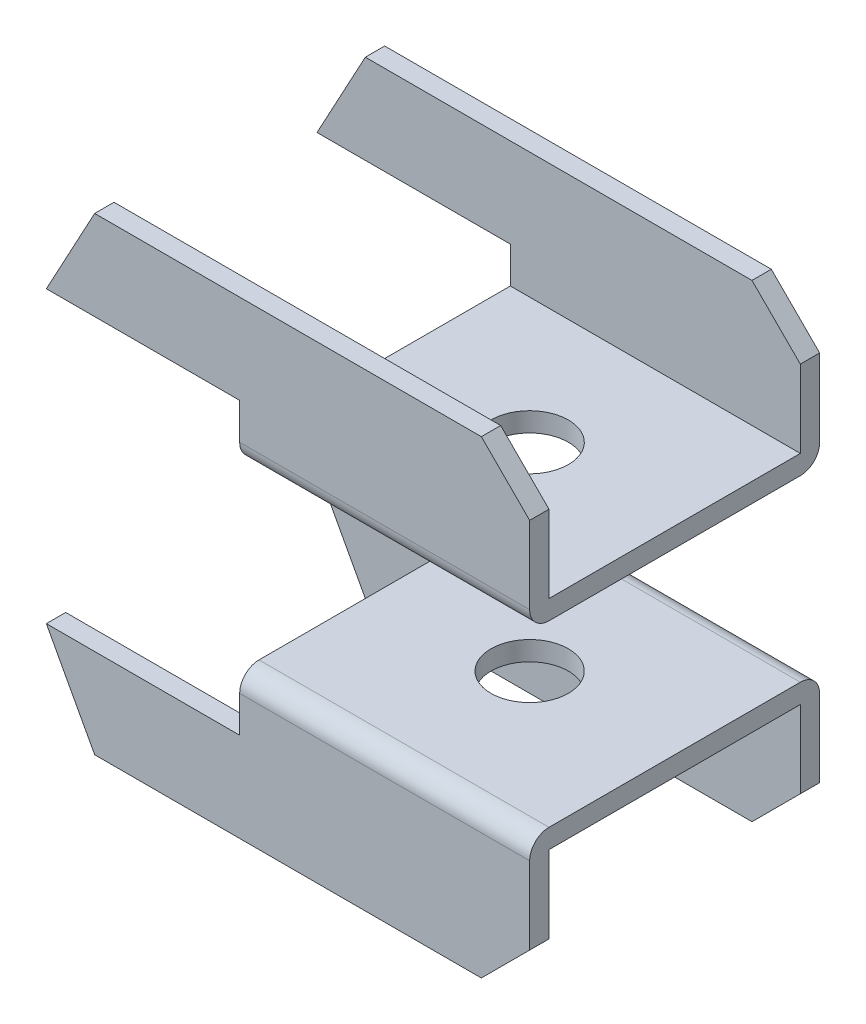
ISO-10303-21;
HEADER;
FILE_DESCRIPTION(('STEP AP214'),'2;1');
FILE_NAME('part.step','',(''),(''),'','','');
FILE_SCHEMA(('AUTOMOTIVE_DESIGN { 1 0 10303 214 1 1 1 1 }'));
ENDSEC;
DATA;
#1=APPLICATION_CONTEXT('core data for automotive mechanical design processes');
#2=APPLICATION_PROTOCOL_DEFINITION('international standard','automotive_design',2000,#1);
#3=PRODUCT_CONTEXT('',#1,'mechanical');
#4=PRODUCT('Part','Part','',(#3));
#5=PRODUCT_RELATED_PRODUCT_CATEGORY('part','',(#4));
#6=PRODUCT_DEFINITION_FORMATION('','',#4);
#7=PRODUCT_DEFINITION_CONTEXT('part definition',#1,'design');
#8=PRODUCT_DEFINITION('design','',#6,#7);
#9=PRODUCT_DEFINITION_SHAPE('','',#8);
#10=(LENGTH_UNIT() NAMED_UNIT(*) SI_UNIT(.MILLI.,.METRE.));
#11=(NAMED_UNIT(*) PLANE_ANGLE_UNIT() SI_UNIT($,.RADIAN.));
#12=(NAMED_UNIT(*) SI_UNIT($,.STERADIAN.) SOLID_ANGLE_UNIT());
#13=UNCERTAINTY_MEASURE_WITH_UNIT(LENGTH_MEASURE(1.E-05),#10,'distance_accuracy_value','');
#14=(GEOMETRIC_REPRESENTATION_CONTEXT(3) GLOBAL_UNCERTAINTY_ASSIGNED_CONTEXT((#13)) GLOBAL_UNIT_ASSIGNED_CONTEXT((#10,
#11,#12)) REPRESENTATION_CONTEXT('',''));
#15=CARTESIAN_POINT('',(0.,0.,0.));
#16=DIRECTION('',(0.,0.,1.));
#17=DIRECTION('',(1.,0.,0.));
#18=AXIS2_PLACEMENT_3D('',#15,#16,#17);
#19=CARTESIAN_POINT('',(0.,0.,-4.));
#20=DIRECTION('',(0.,0.,1.));
#21=DIRECTION('',(1.,0.,0.));
#22=AXIS2_PLACEMENT_3D('',#19,#20,#21);
#23=PLANE('',#22);
#24=DIRECTION('',(0.,-1.,0.));
#25=VECTOR('',#24,1.);
#26=CARTESIAN_POINT('',(60.,0.,-4.));
#27=LINE('',#26,#25);
#28=CARTESIAN_POINT('',(60.,7.5,-4.));
#29=VERTEX_POINT('',#28);
#30=CARTESIAN_POINT('',(60.,-8.49999999999999,-4.));
#31=VERTEX_POINT('',#30);
#32=EDGE_CURVE('E220',#29,#31,#27,.T.);
#33=ORIENTED_EDGE('',*,*,#32,.T.);
#34=DIRECTION('',(-0.707106781186548,-0.707106781186547,0.));
#35=VECTOR('',#34,1.);
#36=CARTESIAN_POINT('',(34.25,-34.25,-4.));
#37=LINE('',#36,#35);
#38=CARTESIAN_POINT('',(50.,-18.5,-4.));
#39=VERTEX_POINT('',#38);
#40=EDGE_CURVE('E293',#31,#39,#37,.T.);
#41=ORIENTED_EDGE('',*,*,#40,.T.);
#42=DIRECTION('',(-1.,0.,0.));
#43=VECTOR('',#42,1.);
#44=CARTESIAN_POINT('',(0.,-18.5,-4.));
#45=LINE('',#44,#43);
#46=CARTESIAN_POINT('',(-30.,-18.5,-4.));
#47=VERTEX_POINT('',#46);
#48=EDGE_CURVE('E218',#39,#47,#45,.T.);
#49=ORIENTED_EDGE('',*,*,#48,.T.);
#50=DIRECTION('',(-0.475517034365474,0.879706513576127,0.));
#51=VECTOR('',#50,1.);
#52=CARTESIAN_POINT('',(-30.9553420011306,-16.7326172979084,-4.));
#53=LINE('',#52,#51);
#54=CARTESIAN_POINT('',(-40.,0.,-4.));
#55=VERTEX_POINT('',#54);
#56=EDGE_CURVE('E215',#47,#55,#53,.T.);
#57=ORIENTED_EDGE('',*,*,#56,.T.);
#58=DIRECTION('',(1.,0.,0.));
#59=VECTOR('',#58,1.);
#60=CARTESIAN_POINT('',(0.,0.,-4.));
#61=LINE('',#60,#59);
#62=CARTESIAN_POINT('',(0.,0.,-4.));
#63=VERTEX_POINT('',#62);
#64=EDGE_CURVE('E212',#55,#63,#61,.T.);
#65=ORIENTED_EDGE('',*,*,#64,.T.);
#66=DIRECTION('',(0.,-1.,0.));
#67=VECTOR('',#66,1.);
#68=CARTESIAN_POINT('',(0.,0.,-4.));
#69=LINE('',#68,#67);
#70=CARTESIAN_POINT('',(0.,7.5,-4.));
#71=VERTEX_POINT('',#70);
#72=EDGE_CURVE('E223',#71,#63,#69,.T.);
#73=ORIENTED_EDGE('',*,*,#72,.F.);
#74=DIRECTION('',(-1.,0.,0.));
#75=VECTOR('',#74,1.);
#76=CARTESIAN_POINT('',(60.,7.5,-4.));
#77=LINE('',#76,#75);
#78=EDGE_CURVE('E195',#29,#71,#77,.T.);
#79=ORIENTED_EDGE('',*,*,#78,.F.);
#80=EDGE_LOOP('',(#33,#41,#49,#57,#65,#73,#79));
#81=FACE_BOUND('',#80,.T.);
#82=ADVANCED_FACE('F48',(#81),#23,.F.);
#83=CARTESIAN_POINT('',(0.,0.,-4.));
#84=DIRECTION('',(0.,-1.,0.));
#85=DIRECTION('',(1.,0.,0.));
#86=AXIS2_PLACEMENT_3D('',#83,#84,#85);
#87=PLANE('',#86);
#88=DIRECTION('',(1.,0.,0.));
#89=VECTOR('',#88,1.);
#90=CARTESIAN_POINT('',(0.,0.,0.));
#91=LINE('',#90,#89);
#92=CARTESIAN_POINT('',(-40.,0.,0.));
#93=VERTEX_POINT('',#92);
#94=CARTESIAN_POINT('',(0.,0.,0.));
#95=VERTEX_POINT('',#94);
#96=EDGE_CURVE('E211',#93,#95,#91,.T.);
#97=ORIENTED_EDGE('',*,*,#96,.T.);
#98=DIRECTION('',(0.,0.,1.));
#99=VECTOR('',#98,1.);
#100=CARTESIAN_POINT('',(0.,0.,-4.));
#101=LINE('',#100,#99);
#102=EDGE_CURVE('E235',#63,#95,#101,.T.);
#103=ORIENTED_EDGE('',*,*,#102,.F.);
#104=ORIENTED_EDGE('',*,*,#64,.F.);
#105=DIRECTION('',(0.,0.,1.));
#106=VECTOR('',#105,1.);
#107=CARTESIAN_POINT('',(-40.,0.,-4.));
#108=LINE('',#107,#106);
#109=EDGE_CURVE('E225',#55,#93,#108,.T.);
#110=ORIENTED_EDGE('',*,*,#109,.T.);
#111=EDGE_LOOP('',(#97,#103,#104,#110));
#112=FACE_BOUND('',#111,.T.);
#113=ADVANCED_FACE('F330',(#112),#87,.F.);
#114=CARTESIAN_POINT('',(0.,0.,-4.));
#115=DIRECTION('',(-1.,0.,0.));
#116=DIRECTION('',(0.,0.,1.));
#117=AXIS2_PLACEMENT_3D('',#114,#115,#116);
#118=PLANE('',#117);
#119=DIRECTION('',(0.,0.,1.));
#120=VECTOR('',#119,1.);
#121=CARTESIAN_POINT('',(0.,11.5,-4.));
#122=LINE('',#121,#120);
#123=CARTESIAN_POINT('',(0.,11.5,-56.));
#124=VERTEX_POINT('',#123);
#125=CARTESIAN_POINT('',(0.,11.5,-4.));
#126=VERTEX_POINT('',#125);
#127=EDGE_CURVE('E238',#124,#126,#122,.T.);
#128=ORIENTED_EDGE('',*,*,#127,.F.);
#129=CARTESIAN_POINT('',(0.,7.5,-56.));
#130=DIRECTION('',(-1.,0.,0.));
#131=DIRECTION('',(0.,0.,1.));
#132=AXIS2_PLACEMENT_3D('',#129,#130,#131);
#133=CIRCLE('',#132,4.);
#134=CARTESIAN_POINT('',(0.,7.5,-60.));
#135=VERTEX_POINT('',#134);
#136=EDGE_CURVE('E57',#124,#135,#133,.T.);
#137=ORIENTED_EDGE('',*,*,#136,.T.);
#138=DIRECTION('',(0.,-1.,0.));
#139=VECTOR('',#138,1.);
#140=CARTESIAN_POINT('',(0.,0.,-60.));
#141=LINE('',#140,#139);
#142=CARTESIAN_POINT('',(0.,0.,-60.));
#143=VERTEX_POINT('',#142);
#144=EDGE_CURVE('E183',#135,#143,#141,.T.);
#145=ORIENTED_EDGE('',*,*,#144,.T.);
#146=DIRECTION('',(0.,0.,-1.));
#147=VECTOR('',#146,1.);
#148=CARTESIAN_POINT('',(0.,0.,-56.));
#149=LINE('',#148,#147);
#150=CARTESIAN_POINT('',(0.,0.,-56.));
#151=VERTEX_POINT('',#150);
#152=EDGE_CURVE('E192',#151,#143,#149,.T.);
#153=ORIENTED_EDGE('',*,*,#152,.F.);
#154=DIRECTION('',(0.,-1.,0.));
#155=VECTOR('',#154,1.);
#156=CARTESIAN_POINT('',(0.,0.,-56.));
#157=LINE('',#156,#155);
#158=CARTESIAN_POINT('',(0.,7.5,-56.));
#159=VERTEX_POINT('',#158);
#160=EDGE_CURVE('E202',#159,#151,#157,.T.);
#161=ORIENTED_EDGE('',*,*,#160,.F.);
#162=DIRECTION('',(0.,0.,1.));
#163=VECTOR('',#162,1.);
#164=CARTESIAN_POINT('',(0.,7.5,-56.));
#165=LINE('',#164,#163);
#166=EDGE_CURVE('E205',#159,#71,#165,.T.);
#167=ORIENTED_EDGE('',*,*,#166,.T.);
#168=ORIENTED_EDGE('',*,*,#72,.T.);
#169=ORIENTED_EDGE('',*,*,#102,.T.);
#170=DIRECTION('',(0.,-1.,0.));
#171=VECTOR('',#170,1.);
#172=CARTESIAN_POINT('',(0.,0.,0.));
#173=LINE('',#172,#171);
#174=CARTESIAN_POINT('',(0.,7.5,0.));
#175=VERTEX_POINT('',#174);
#176=EDGE_CURVE('E216',#175,#95,#173,.T.);
#177=ORIENTED_EDGE('',*,*,#176,.F.);
#178=CARTESIAN_POINT('',(0.,7.5,-4.));
#179=DIRECTION('',(-1.,0.,0.));
#180=DIRECTION('',(0.,0.,1.));
#181=AXIS2_PLACEMENT_3D('',#178,#179,#180);
#182=CIRCLE('',#181,4.);
#183=EDGE_CURVE('E259',#175,#126,#182,.T.);
#184=ORIENTED_EDGE('',*,*,#183,.T.);
#185=EDGE_LOOP('',(#128,#137,#145,#153,#161,#167,#168,#169,#177,#184));
#186=FACE_BOUND('',#185,.T.);
#187=ADVANCED_FACE('F264',(#186),#118,.T.);
#188=CARTESIAN_POINT('',(0.,11.5,-4.));
#189=DIRECTION('',(0.,-1.,0.));
#190=DIRECTION('',(0.,0.,-1.));
#191=AXIS2_PLACEMENT_3D('',#188,#189,#190);
#192=PLANE('',#191);
#193=CARTESIAN_POINT('',(30.,11.5,-30.));
#194=DIRECTION('',(0.,-1.,0.));
#195=DIRECTION('',(0.,0.,-1.));
#196=AXIS2_PLACEMENT_3D('',#193,#194,#195);
#197=CIRCLE('',#196,8.);
#198=CARTESIAN_POINT('',(30.,11.5,-38.));
#199=VERTEX_POINT('',#198);
#200=EDGE_CURVE('E285',#199,#199,#197,.T.);
#201=ORIENTED_EDGE('',*,*,#200,.T.);
#202=EDGE_LOOP('',(#201));
#203=FACE_BOUND('',#202,.T.);
#204=DIRECTION('',(0.,0.,1.));
#205=VECTOR('',#204,1.);
#206=CARTESIAN_POINT('',(60.,11.5,-4.));
#207=LINE('',#206,#205);
#208=CARTESIAN_POINT('',(60.,11.5,-56.));
#209=VERTEX_POINT('',#208);
#210=CARTESIAN_POINT('',(60.,11.5,-4.));
#211=VERTEX_POINT('',#210);
#212=EDGE_CURVE('E241',#209,#211,#207,.T.);
#213=ORIENTED_EDGE('',*,*,#212,.F.);
#214=DIRECTION('',(1.,0.,0.));
#215=VECTOR('',#214,1.);
#216=CARTESIAN_POINT('',(0.,11.5,-56.));
#217=LINE('',#216,#215);
#218=EDGE_CURVE('E257',#209,#124,#217,.F.);
#219=ORIENTED_EDGE('',*,*,#218,.T.);
#220=ORIENTED_EDGE('',*,*,#127,.T.);
#221=DIRECTION('',(1.,0.,0.));
#222=VECTOR('',#221,1.);
#223=CARTESIAN_POINT('',(60.,11.5,-4.));
#224=LINE('',#223,#222);
#225=EDGE_CURVE('E254',#126,#211,#224,.T.);
#226=ORIENTED_EDGE('',*,*,#225,.T.);
#227=EDGE_LOOP('',(#213,#219,#220,#226));
#228=FACE_BOUND('',#227,.T.);
#229=ADVANCED_FACE('F273',(#203,#228),#192,.F.);
#230=CARTESIAN_POINT('',(60.,0.,-4.));
#231=DIRECTION('',(-1.,0.,0.));
#232=DIRECTION('',(0.,-1.,0.));
#233=AXIS2_PLACEMENT_3D('',#230,#231,#232);
#234=PLANE('',#233);
#235=DIRECTION('',(0.,-1.,0.));
#236=VECTOR('',#235,1.);
#237=CARTESIAN_POINT('',(60.,0.,0.));
#238=LINE('',#237,#236);
#239=CARTESIAN_POINT('',(60.,7.5,0.));
#240=VERTEX_POINT('',#239);
#241=CARTESIAN_POINT('',(60.,-8.49999999999999,0.));
#242=VERTEX_POINT('',#241);
#243=EDGE_CURVE('E232',#240,#242,#238,.T.);
#244=ORIENTED_EDGE('',*,*,#243,.T.);
#245=DIRECTION('',(0.,0.,1.));
#246=VECTOR('',#245,1.);
#247=CARTESIAN_POINT('',(60.,-8.49999999999999,-60.));
#248=LINE('',#247,#246);
#249=EDGE_CURVE('E64',#31,#242,#248,.T.);
#250=ORIENTED_EDGE('',*,*,#249,.F.);
#251=ORIENTED_EDGE('',*,*,#32,.F.);
#252=DIRECTION('',(0.,0.,1.));
#253=VECTOR('',#252,1.);
#254=CARTESIAN_POINT('',(60.,7.5,-56.));
#255=LINE('',#254,#253);
#256=CARTESIAN_POINT('',(60.,7.5,-56.));
#257=VERTEX_POINT('',#256);
#258=EDGE_CURVE('E208',#257,#29,#255,.T.);
#259=ORIENTED_EDGE('',*,*,#258,.F.);
#260=DIRECTION('',(0.,-1.,0.));
#261=VECTOR('',#260,1.);
#262=CARTESIAN_POINT('',(60.,0.,-56.));
#263=LINE('',#262,#261);
#264=CARTESIAN_POINT('',(60.,-8.49999999999999,-56.));
#265=VERTEX_POINT('',#264);
#266=EDGE_CURVE('E175',#257,#265,#263,.T.);
#267=ORIENTED_EDGE('',*,*,#266,.T.);
#268=CARTESIAN_POINT('',(60.,-8.49999999999999,-60.));
#269=VERTEX_POINT('',#268);
#270=EDGE_CURVE('E161',#269,#265,#248,.T.);
#271=ORIENTED_EDGE('',*,*,#270,.F.);
#272=DIRECTION('',(0.,-1.,0.));
#273=VECTOR('',#272,1.);
#274=CARTESIAN_POINT('',(60.,0.,-60.));
#275=LINE('',#274,#273);
#276=CARTESIAN_POINT('',(60.,7.5,-60.));
#277=VERTEX_POINT('',#276);
#278=EDGE_CURVE('E173',#277,#269,#275,.T.);
#279=ORIENTED_EDGE('',*,*,#278,.F.);
#280=CARTESIAN_POINT('',(60.,7.5,-56.));
#281=DIRECTION('',(-1.,0.,0.));
#282=DIRECTION('',(0.,-1.,0.));
#283=AXIS2_PLACEMENT_3D('',#280,#281,#282);
#284=CIRCLE('',#283,4.);
#285=EDGE_CURVE('E252',#277,#209,#284,.F.);
#286=ORIENTED_EDGE('',*,*,#285,.T.);
#287=ORIENTED_EDGE('',*,*,#212,.T.);
#288=CARTESIAN_POINT('',(60.,7.5,-4.));
#289=DIRECTION('',(-1.,0.,0.));
#290=DIRECTION('',(0.,-1.,0.));
#291=AXIS2_PLACEMENT_3D('',#288,#289,#290);
#292=CIRCLE('',#291,4.);
#293=EDGE_CURVE('E250',#211,#240,#292,.F.);
#294=ORIENTED_EDGE('',*,*,#293,.T.);
#295=EDGE_LOOP('',(#244,#250,#251,#259,#267,#271,#279,#286,#287,#294));
#296=FACE_BOUND('',#295,.T.);
#297=ADVANCED_FACE('F172',(#296),#234,.F.);
#298=CARTESIAN_POINT('',(0.,-18.5,-4.));
#299=DIRECTION('',(0.,1.,0.));
#300=DIRECTION('',(0.,0.,1.));
#301=AXIS2_PLACEMENT_3D('',#298,#299,#300);
#302=PLANE('',#301);
#303=ORIENTED_EDGE('',*,*,#48,.F.);
#304=DIRECTION('',(0.,0.,1.));
#305=VECTOR('',#304,1.);
#306=CARTESIAN_POINT('',(50.,-18.5,-60.));
#307=LINE('',#306,#305);
#308=CARTESIAN_POINT('',(50.,-18.5,0.));
#309=VERTEX_POINT('',#308);
#310=EDGE_CURVE('E176',#39,#309,#307,.T.);
#311=ORIENTED_EDGE('',*,*,#310,.T.);
#312=DIRECTION('',(-1.,0.,0.));
#313=VECTOR('',#312,1.);
#314=CARTESIAN_POINT('',(0.,-18.5,0.));
#315=LINE('',#314,#313);
#316=CARTESIAN_POINT('',(-30.,-18.5,0.));
#317=VERTEX_POINT('',#316);
#318=EDGE_CURVE('E230',#309,#317,#315,.T.);
#319=ORIENTED_EDGE('',*,*,#318,.T.);
#320=DIRECTION('',(0.,0.,1.));
#321=VECTOR('',#320,1.);
#322=CARTESIAN_POINT('',(-30.,-18.5,-4.));
#323=LINE('',#322,#321);
#324=EDGE_CURVE('E244',#47,#317,#323,.T.);
#325=ORIENTED_EDGE('',*,*,#324,.F.);
#326=EDGE_LOOP('',(#303,#311,#319,#325));
#327=FACE_BOUND('',#326,.T.);
#328=ADVANCED_FACE('F338',(#327),#302,.F.);
#329=CARTESIAN_POINT('',(-30.9553420011306,-16.7326172979084,-4.));
#330=DIRECTION('',(0.879706513576127,0.475517034365474,0.));
#331=DIRECTION('',(-0.475517034365474,0.879706513576127,0.));
#332=AXIS2_PLACEMENT_3D('',#329,#330,#331);
#333=PLANE('',#332);
#334=DIRECTION('',(-0.475517034365474,0.879706513576127,0.));
#335=VECTOR('',#334,1.);
#336=CARTESIAN_POINT('',(-30.9553420011306,-16.7326172979084,0.));
#337=LINE('',#336,#335);
#338=EDGE_CURVE('E228',#317,#93,#337,.T.);
#339=ORIENTED_EDGE('',*,*,#338,.T.);
#340=ORIENTED_EDGE('',*,*,#109,.F.);
#341=ORIENTED_EDGE('',*,*,#56,.F.);
#342=ORIENTED_EDGE('',*,*,#324,.T.);
#343=EDGE_LOOP('',(#339,#340,#341,#342));
#344=FACE_BOUND('',#343,.T.);
#345=ADVANCED_FACE('F333',(#344),#333,.F.);
#346=CARTESIAN_POINT('',(0.,0.,0.));
#347=DIRECTION('',(0.,0.,1.));
#348=DIRECTION('',(1.,0.,0.));
#349=AXIS2_PLACEMENT_3D('',#346,#347,#348);
#350=PLANE('',#349);
#351=DIRECTION('',(-0.707106781186548,-0.707106781186547,0.));
#352=VECTOR('',#351,1.);
#353=CARTESIAN_POINT('',(50.,-18.5,0.));
#354=LINE('',#353,#352);
#355=EDGE_CURVE('E166',#242,#309,#354,.T.);
#356=ORIENTED_EDGE('',*,*,#355,.F.);
#357=ORIENTED_EDGE('',*,*,#243,.F.);
#358=DIRECTION('',(1.,0.,0.));
#359=VECTOR('',#358,1.);
#360=CARTESIAN_POINT('',(0.,7.5,0.));
#361=LINE('',#360,#359);
#362=EDGE_CURVE('E12',#240,#175,#361,.F.);
#363=ORIENTED_EDGE('',*,*,#362,.T.);
#364=ORIENTED_EDGE('',*,*,#176,.T.);
#365=ORIENTED_EDGE('',*,*,#96,.F.);
#366=ORIENTED_EDGE('',*,*,#338,.F.);
#367=ORIENTED_EDGE('',*,*,#318,.F.);
#368=EDGE_LOOP('',(#356,#357,#363,#364,#365,#366,#367));
#369=FACE_BOUND('',#368,.T.);
#370=ADVANCED_FACE('F280',(#369),#350,.T.);
#371=CARTESIAN_POINT('',(60.,7.5,-56.));
#372=DIRECTION('',(0.,1.,0.));
#373=DIRECTION('',(0.,0.,1.));
#374=AXIS2_PLACEMENT_3D('',#371,#372,#373);
#375=PLANE('',#374);
#376=CARTESIAN_POINT('',(30.,7.5,-30.));
#377=DIRECTION('',(0.,1.,0.));
#378=DIRECTION('',(0.,0.,1.));
#379=AXIS2_PLACEMENT_3D('',#376,#377,#378);
#380=CIRCLE('',#379,8.);
#381=CARTESIAN_POINT('',(30.,7.5,-22.));
#382=VERTEX_POINT('',#381);
#383=EDGE_CURVE('E52',#382,#382,#380,.T.);
#384=ORIENTED_EDGE('',*,*,#383,.T.);
#385=EDGE_LOOP('',(#384));
#386=FACE_BOUND('',#385,.T.);
#387=ORIENTED_EDGE('',*,*,#78,.T.);
#388=ORIENTED_EDGE('',*,*,#166,.F.);
#389=DIRECTION('',(-1.,0.,0.));
#390=VECTOR('',#389,1.);
#391=CARTESIAN_POINT('',(60.,7.5,-56.));
#392=LINE('',#391,#390);
#393=EDGE_CURVE('E296',#257,#159,#392,.T.);
#394=ORIENTED_EDGE('',*,*,#393,.F.);
#395=ORIENTED_EDGE('',*,*,#258,.T.);
#396=EDGE_LOOP('',(#387,#388,#394,#395));
#397=FACE_BOUND('',#396,.T.);
#398=ADVANCED_FACE('F323',(#386,#397),#375,.F.);
#399=CARTESIAN_POINT('',(0.,0.,-56.));
#400=DIRECTION('',(0.,0.,-1.));
#401=DIRECTION('',(1.,0.,0.));
#402=AXIS2_PLACEMENT_3D('',#399,#400,#401);
#403=PLANE('',#402);
#404=DIRECTION('',(-1.,0.,0.));
#405=VECTOR('',#404,1.);
#406=CARTESIAN_POINT('',(0.,-18.5,-56.));
#407=LINE('',#406,#405);
#408=CARTESIAN_POINT('',(50.,-18.5,-56.));
#409=VERTEX_POINT('',#408);
#410=CARTESIAN_POINT('',(-30.,-18.5,-56.));
#411=VERTEX_POINT('',#410);
#412=EDGE_CURVE('E304',#409,#411,#407,.T.);
#413=ORIENTED_EDGE('',*,*,#412,.F.);
#414=DIRECTION('',(0.707106781186548,0.707106781186547,0.));
#415=VECTOR('',#414,1.);
#416=CARTESIAN_POINT('',(34.25,-34.25,-56.));
#417=LINE('',#416,#415);
#418=EDGE_CURVE('E290',#409,#265,#417,.T.);
#419=ORIENTED_EDGE('',*,*,#418,.T.);
#420=ORIENTED_EDGE('',*,*,#266,.F.);
#421=ORIENTED_EDGE('',*,*,#393,.T.);
#422=ORIENTED_EDGE('',*,*,#160,.T.);
#423=DIRECTION('',(1.,0.,0.));
#424=VECTOR('',#423,1.);
#425=CARTESIAN_POINT('',(0.,0.,-56.));
#426=LINE('',#425,#424);
#427=CARTESIAN_POINT('',(-40.,0.,-56.));
#428=VERTEX_POINT('',#427);
#429=EDGE_CURVE('E186',#428,#151,#426,.T.);
#430=ORIENTED_EDGE('',*,*,#429,.F.);
#431=DIRECTION('',(-0.475517034365474,0.879706513576127,0.));
#432=VECTOR('',#431,1.);
#433=CARTESIAN_POINT('',(-30.9553420011306,-16.7326172979084,-56.));
#434=LINE('',#433,#432);
#435=EDGE_CURVE('E301',#411,#428,#434,.T.);
#436=ORIENTED_EDGE('',*,*,#435,.F.);
#437=EDGE_LOOP('',(#413,#419,#420,#421,#422,#430,#436));
#438=FACE_BOUND('',#437,.T.);
#439=ADVANCED_FACE('F321',(#438),#403,.F.);
#440=CARTESIAN_POINT('',(0.,0.,-56.));
#441=DIRECTION('',(0.,-1.,0.));
#442=DIRECTION('',(1.,0.,0.));
#443=AXIS2_PLACEMENT_3D('',#440,#441,#442);
#444=PLANE('',#443);
#445=DIRECTION('',(1.,0.,0.));
#446=VECTOR('',#445,1.);
#447=CARTESIAN_POINT('',(0.,0.,-60.));
#448=LINE('',#447,#446);
#449=CARTESIAN_POINT('',(-40.,0.,-60.));
#450=VERTEX_POINT('',#449);
#451=EDGE_CURVE('E269',#450,#143,#448,.T.);
#452=ORIENTED_EDGE('',*,*,#451,.F.);
#453=DIRECTION('',(0.,0.,-1.));
#454=VECTOR('',#453,1.);
#455=CARTESIAN_POINT('',(-40.,0.,-56.));
#456=LINE('',#455,#454);
#457=EDGE_CURVE('E199',#428,#450,#456,.T.);
#458=ORIENTED_EDGE('',*,*,#457,.F.);
#459=ORIENTED_EDGE('',*,*,#429,.T.);
#460=ORIENTED_EDGE('',*,*,#152,.T.);
#461=EDGE_LOOP('',(#452,#458,#459,#460));
#462=FACE_BOUND('',#461,.T.);
#463=ADVANCED_FACE('F316',(#462),#444,.F.);
#464=CARTESIAN_POINT('',(0.,-18.5,-56.));
#465=DIRECTION('',(0.,1.,0.));
#466=DIRECTION('',(0.,0.,-1.));
#467=AXIS2_PLACEMENT_3D('',#464,#465,#466);
#468=PLANE('',#467);
#469=DIRECTION('',(-1.,0.,0.));
#470=VECTOR('',#469,1.);
#471=CARTESIAN_POINT('',(0.,-18.5,-60.));
#472=LINE('',#471,#470);
#473=CARTESIAN_POINT('',(50.,-18.5,-60.));
#474=VERTEX_POINT('',#473);
#475=CARTESIAN_POINT('',(-30.,-18.5,-60.));
#476=VERTEX_POINT('',#475);
#477=EDGE_CURVE('E184',#474,#476,#472,.T.);
#478=ORIENTED_EDGE('',*,*,#477,.F.);
#479=EDGE_CURVE('E72',#474,#409,#307,.T.);
#480=ORIENTED_EDGE('',*,*,#479,.T.);
#481=ORIENTED_EDGE('',*,*,#412,.T.);
#482=DIRECTION('',(0.,0.,-1.));
#483=VECTOR('',#482,1.);
#484=CARTESIAN_POINT('',(-30.,-18.5,-56.));
#485=LINE('',#484,#483);
#486=EDGE_CURVE('E196',#411,#476,#485,.T.);
#487=ORIENTED_EDGE('',*,*,#486,.T.);
#488=EDGE_LOOP('',(#478,#480,#481,#487));
#489=FACE_BOUND('',#488,.T.);
#490=ADVANCED_FACE('F380',(#489),#468,.F.);
#491=CARTESIAN_POINT('',(-30.9553420011306,-16.7326172979084,-56.));
#492=DIRECTION('',(0.879706513576127,0.475517034365474,0.));
#493=DIRECTION('',(-0.475517034365474,0.879706513576127,0.));
#494=AXIS2_PLACEMENT_3D('',#491,#492,#493);
#495=PLANE('',#494);
#496=DIRECTION('',(-0.475517034365474,0.879706513576127,0.));
#497=VECTOR('',#496,1.);
#498=CARTESIAN_POINT('',(-30.9553420011306,-16.7326172979084,-60.));
#499=LINE('',#498,#497);
#500=EDGE_CURVE('E188',#476,#450,#499,.T.);
#501=ORIENTED_EDGE('',*,*,#500,.F.);
#502=ORIENTED_EDGE('',*,*,#486,.F.);
#503=ORIENTED_EDGE('',*,*,#435,.T.);
#504=ORIENTED_EDGE('',*,*,#457,.T.);
#505=EDGE_LOOP('',(#501,#502,#503,#504));
#506=FACE_BOUND('',#505,.T.);
#507=ADVANCED_FACE('F312',(#506),#495,.F.);
#508=CARTESIAN_POINT('',(0.,0.,-60.));
#509=DIRECTION('',(0.,0.,-1.));
#510=DIRECTION('',(1.,0.,0.));
#511=AXIS2_PLACEMENT_3D('',#508,#509,#510);
#512=PLANE('',#511);
#513=DIRECTION('',(-0.707106781186548,-0.707106781186547,0.));
#514=VECTOR('',#513,1.);
#515=CARTESIAN_POINT('',(50.,-18.5,-60.));
#516=LINE('',#515,#514);
#517=EDGE_CURVE('E158',#269,#474,#516,.T.);
#518=ORIENTED_EDGE('',*,*,#517,.T.);
#519=ORIENTED_EDGE('',*,*,#477,.T.);
#520=ORIENTED_EDGE('',*,*,#500,.T.);
#521=ORIENTED_EDGE('',*,*,#451,.T.);
#522=ORIENTED_EDGE('',*,*,#144,.F.);
#523=DIRECTION('',(1.,0.,0.));
#524=VECTOR('',#523,1.);
#525=CARTESIAN_POINT('',(60.,7.5,-60.));
#526=LINE('',#525,#524);
#527=EDGE_CURVE('E182',#135,#277,#526,.T.);
#528=ORIENTED_EDGE('',*,*,#527,.T.);
#529=ORIENTED_EDGE('',*,*,#278,.T.);
#530=EDGE_LOOP('',(#518,#519,#520,#521,#522,#528,#529));
#531=FACE_BOUND('',#530,.T.);
#532=ADVANCED_FACE('F179',(#531),#512,.T.);
#533=CARTESIAN_POINT('',(0.,7.5,-56.));
#534=DIRECTION('',(-1.,0.,0.));
#535=DIRECTION('',(0.,0.,1.));
#536=AXIS2_PLACEMENT_3D('',#533,#534,#535);
#537=CYLINDRICAL_SURFACE('',#536,4.);
#538=ORIENTED_EDGE('',*,*,#136,.F.);
#539=ORIENTED_EDGE('',*,*,#218,.F.);
#540=ORIENTED_EDGE('',*,*,#285,.F.);
#541=ORIENTED_EDGE('',*,*,#527,.F.);
#542=EDGE_LOOP('',(#538,#539,#540,#541));
#543=FACE_BOUND('',#542,.T.);
#544=ADVANCED_FACE('F270',(#543),#537,.T.);
#545=CARTESIAN_POINT('',(0.,7.5,-4.));
#546=DIRECTION('',(-1.,0.,0.));
#547=DIRECTION('',(0.,0.,1.));
#548=AXIS2_PLACEMENT_3D('',#545,#546,#547);
#549=CYLINDRICAL_SURFACE('',#548,4.);
#550=ORIENTED_EDGE('',*,*,#183,.F.);
#551=ORIENTED_EDGE('',*,*,#362,.F.);
#552=ORIENTED_EDGE('',*,*,#293,.F.);
#553=ORIENTED_EDGE('',*,*,#225,.F.);
#554=EDGE_LOOP('',(#550,#551,#552,#553));
#555=FACE_BOUND('',#554,.T.);
#556=ADVANCED_FACE('F50',(#555),#549,.T.);
#557=CARTESIAN_POINT('',(50.,-18.5,-60.));
#558=DIRECTION('',(-0.707106781186547,0.707106781186548,0.));
#559=DIRECTION('',(-0.707106781186548,-0.707106781186547,0.));
#560=AXIS2_PLACEMENT_3D('',#557,#558,#559);
#561=PLANE('',#560);
#562=ORIENTED_EDGE('',*,*,#479,.F.);
#563=ORIENTED_EDGE('',*,*,#517,.F.);
#564=ORIENTED_EDGE('',*,*,#270,.T.);
#565=ORIENTED_EDGE('',*,*,#418,.F.);
#566=EDGE_LOOP('',(#562,#563,#564,#565));
#567=FACE_BOUND('',#566,.T.);
#568=ADVANCED_FACE('F160',(#567),#561,.F.);
#569=ORIENTED_EDGE('',*,*,#249,.T.);
#570=ORIENTED_EDGE('',*,*,#355,.T.);
#571=ORIENTED_EDGE('',*,*,#310,.F.);
#572=ORIENTED_EDGE('',*,*,#40,.F.);
#573=EDGE_LOOP('',(#569,#570,#571,#572));
#574=FACE_BOUND('',#573,.T.);
#575=ADVANCED_FACE('F339',(#574),#561,.F.);
#576=CARTESIAN_POINT('',(30.,-48.5,-30.));
#577=DIRECTION('',(0.,1.,0.));
#578=DIRECTION('',(0.,0.,1.));
#579=AXIS2_PLACEMENT_3D('',#576,#577,#578);
#580=CYLINDRICAL_SURFACE('',#579,8.);
#581=ORIENTED_EDGE('',*,*,#383,.F.);
#582=EDGE_LOOP('',(#581));
#583=FACE_BOUND('',#582,.T.);
#584=ORIENTED_EDGE('',*,*,#200,.F.);
#585=EDGE_LOOP('',(#584));
#586=FACE_BOUND('',#585,.T.);
#587=ADVANCED_FACE('F341',(#583,#586),#580,.F.);
#588=CLOSED_SHELL('',(#82,#113,#187,#229,#297,#328,#345,#370,#398,#439,#463,#490,#507,#532,#544,
#556,#568,#575,#587));
#589=MANIFOLD_SOLID_BREP('B2',#588);
#590=CARTESIAN_POINT('',(0.,0.,-4.));
#591=DIRECTION('',(0.,0.,1.));
#592=DIRECTION('',(1.,0.,0.));
#593=AXIS2_PLACEMENT_3D('',#590,#591,#592);
#594=PLANE('',#593);
#595=DIRECTION('',(-1.,0.,0.));
#596=VECTOR('',#595,1.);
#597=CARTESIAN_POINT('',(0.,78.5,-4.));
#598=LINE('',#597,#596);
#599=CARTESIAN_POINT('',(50.,78.5,-4.));
#600=VERTEX_POINT('',#599);
#601=CARTESIAN_POINT('',(-30.,78.5,-4.));
#602=VERTEX_POINT('',#601);
#603=EDGE_CURVE('E714',#600,#602,#598,.T.);
#604=ORIENTED_EDGE('',*,*,#603,.F.);
#605=DIRECTION('',(0.707106781186548,-0.707106781186547,0.));
#606=VECTOR('',#605,1.);
#607=CARTESIAN_POINT('',(64.25,64.25,-4.));
#608=LINE('',#607,#606);
#609=CARTESIAN_POINT('',(60.,68.5,-4.));
#610=VERTEX_POINT('',#609);
#611=EDGE_CURVE('E807',#600,#610,#608,.T.);
#612=ORIENTED_EDGE('',*,*,#611,.T.);
#613=DIRECTION('',(0.,1.,0.));
#614=VECTOR('',#613,1.);
#615=CARTESIAN_POINT('',(60.,0.,-4.));
#616=LINE('',#615,#614);
#617=CARTESIAN_POINT('',(60.,52.5,-4.));
#618=VERTEX_POINT('',#617);
#619=EDGE_CURVE('E711',#618,#610,#616,.T.);
#620=ORIENTED_EDGE('',*,*,#619,.F.);
#621=DIRECTION('',(1.,0.,0.));
#622=VECTOR('',#621,1.);
#623=CARTESIAN_POINT('',(0.,52.5,-4.));
#624=LINE('',#623,#622);
#625=CARTESIAN_POINT('',(0.,52.5,-4.));
#626=VERTEX_POINT('',#625);
#627=EDGE_CURVE('E688',#626,#618,#624,.T.);
#628=ORIENTED_EDGE('',*,*,#627,.F.);
#629=DIRECTION('',(0.,-1.,0.));
#630=VECTOR('',#629,1.);
#631=CARTESIAN_POINT('',(0.,0.,-4.));
#632=LINE('',#631,#630);
#633=CARTESIAN_POINT('',(0.,60.,-4.));
#634=VERTEX_POINT('',#633);
#635=EDGE_CURVE('E707',#634,#626,#632,.T.);
#636=ORIENTED_EDGE('',*,*,#635,.F.);
#637=DIRECTION('',(1.,0.,0.));
#638=VECTOR('',#637,1.);
#639=CARTESIAN_POINT('',(0.,60.,-4.));
#640=LINE('',#639,#638);
#641=CARTESIAN_POINT('',(-40.,60.,-4.));
#642=VERTEX_POINT('',#641);
#643=EDGE_CURVE('E704',#642,#634,#640,.T.);
#644=ORIENTED_EDGE('',*,*,#643,.F.);
#645=DIRECTION('',(-0.475517034365474,-0.879706513576127,0.));
#646=VECTOR('',#645,1.);
#647=CARTESIAN_POINT('',(-56.0542679479932,30.2996042962126,-4.));
#648=LINE('',#647,#646);
#649=EDGE_CURVE('E716',#602,#642,#648,.T.);
#650=ORIENTED_EDGE('',*,*,#649,.F.);
#651=EDGE_LOOP('',(#604,#612,#620,#628,#636,#644,#650));
#652=FACE_BOUND('',#651,.T.);
#653=ADVANCED_FACE('F543',(#652),#594,.F.);
#654=CARTESIAN_POINT('',(0.,60.,-4.));
#655=DIRECTION('',(0.,-1.,0.));
#656=DIRECTION('',(0.,0.,-1.));
#657=AXIS2_PLACEMENT_3D('',#654,#655,#656);
#658=PLANE('',#657);
#659=DIRECTION('',(1.,0.,0.));
#660=VECTOR('',#659,1.);
#661=CARTESIAN_POINT('',(0.,60.,0.));
#662=LINE('',#661,#660);
#663=CARTESIAN_POINT('',(-40.,60.,0.));
#664=VERTEX_POINT('',#663);
#665=CARTESIAN_POINT('',(0.,60.,0.));
#666=VERTEX_POINT('',#665);
#667=EDGE_CURVE('E703',#664,#666,#662,.T.);
#668=ORIENTED_EDGE('',*,*,#667,.F.);
#669=DIRECTION('',(0.,0.,1.));
#670=VECTOR('',#669,1.);
#671=CARTESIAN_POINT('',(-40.,60.,-4.));
#672=LINE('',#671,#670);
#673=EDGE_CURVE('E732',#642,#664,#672,.T.);
#674=ORIENTED_EDGE('',*,*,#673,.F.);
#675=ORIENTED_EDGE('',*,*,#643,.T.);
#676=DIRECTION('',(0.,0.,1.));
#677=VECTOR('',#676,1.);
#678=CARTESIAN_POINT('',(0.,60.,-4.));
#679=LINE('',#678,#677);
#680=EDGE_CURVE('E719',#634,#666,#679,.T.);
#681=ORIENTED_EDGE('',*,*,#680,.T.);
#682=EDGE_LOOP('',(#668,#674,#675,#681));
#683=FACE_BOUND('',#682,.T.);
#684=ADVANCED_FACE('F784',(#683),#658,.T.);
#685=CARTESIAN_POINT('',(-56.0542679479932,30.2996042962126,-4.));
#686=DIRECTION('',(-0.879706513576127,0.475517034365474,0.));
#687=DIRECTION('',(-0.475517034365474,-0.879706513576127,0.));
#688=AXIS2_PLACEMENT_3D('',#685,#686,#687);
#689=PLANE('',#688);
#690=DIRECTION('',(-0.475517034365474,-0.879706513576127,0.));
#691=VECTOR('',#690,1.);
#692=CARTESIAN_POINT('',(-56.0542679479932,30.2996042962126,0.));
#693=LINE('',#692,#691);
#694=CARTESIAN_POINT('',(-30.,78.5,0.));
#695=VERTEX_POINT('',#694);
#696=EDGE_CURVE('E708',#695,#664,#693,.T.);
#697=ORIENTED_EDGE('',*,*,#696,.F.);
#698=DIRECTION('',(0.,0.,1.));
#699=VECTOR('',#698,1.);
#700=CARTESIAN_POINT('',(-30.,78.5,-4.));
#701=LINE('',#700,#699);
#702=EDGE_CURVE('E735',#602,#695,#701,.T.);
#703=ORIENTED_EDGE('',*,*,#702,.F.);
#704=ORIENTED_EDGE('',*,*,#649,.T.);
#705=ORIENTED_EDGE('',*,*,#673,.T.);
#706=EDGE_LOOP('',(#697,#703,#704,#705));
#707=FACE_BOUND('',#706,.T.);
#708=ADVANCED_FACE('F840',(#707),#689,.T.);
#709=CARTESIAN_POINT('',(0.,78.5,-4.));
#710=DIRECTION('',(0.,1.,0.));
#711=DIRECTION('',(-1.,0.,0.));
#712=AXIS2_PLACEMENT_3D('',#709,#710,#711);
#713=PLANE('',#712);
#714=DIRECTION('',(0.,0.,1.));
#715=VECTOR('',#714,1.);
#716=CARTESIAN_POINT('',(50.,78.5,-60.));
#717=LINE('',#716,#715);
#718=CARTESIAN_POINT('',(50.,78.5,0.));
#719=VERTEX_POINT('',#718);
#720=EDGE_CURVE('E559',#600,#719,#717,.T.);
#721=ORIENTED_EDGE('',*,*,#720,.F.);
#722=ORIENTED_EDGE('',*,*,#603,.T.);
#723=ORIENTED_EDGE('',*,*,#702,.T.);
#724=DIRECTION('',(-1.,0.,0.));
#725=VECTOR('',#724,1.);
#726=CARTESIAN_POINT('',(0.,78.5,0.));
#727=LINE('',#726,#725);
#728=EDGE_CURVE('E728',#719,#695,#727,.T.);
#729=ORIENTED_EDGE('',*,*,#728,.F.);
#730=EDGE_LOOP('',(#721,#722,#723,#729));
#731=FACE_BOUND('',#730,.T.);
#732=ADVANCED_FACE('F847',(#731),#713,.T.);
#733=CARTESIAN_POINT('',(60.,0.,-4.));
#734=DIRECTION('',(1.,0.,0.));
#735=DIRECTION('',(0.,0.,-1.));
#736=AXIS2_PLACEMENT_3D('',#733,#734,#735);
#737=PLANE('',#736);
#738=DIRECTION('',(0.,0.,1.));
#739=VECTOR('',#738,1.);
#740=CARTESIAN_POINT('',(60.,68.5,-60.));
#741=LINE('',#740,#739);
#742=CARTESIAN_POINT('',(60.,68.5,0.));
#743=VERTEX_POINT('',#742);
#744=EDGE_CURVE('E671',#610,#743,#741,.T.);
#745=ORIENTED_EDGE('',*,*,#744,.T.);
#746=DIRECTION('',(0.,1.,0.));
#747=VECTOR('',#746,1.);
#748=CARTESIAN_POINT('',(60.,0.,0.));
#749=LINE('',#748,#747);
#750=CARTESIAN_POINT('',(60.,52.5,0.));
#751=VERTEX_POINT('',#750);
#752=EDGE_CURVE('E725',#751,#743,#749,.T.);
#753=ORIENTED_EDGE('',*,*,#752,.F.);
#754=CARTESIAN_POINT('',(60.,52.5,-4.));
#755=DIRECTION('',(1.,0.,0.));
#756=DIRECTION('',(0.,0.,-1.));
#757=AXIS2_PLACEMENT_3D('',#754,#755,#756);
#758=CIRCLE('',#757,4.);
#759=CARTESIAN_POINT('',(60.,48.5,-4.));
#760=VERTEX_POINT('',#759);
#761=EDGE_CURVE('E756',#751,#760,#758,.T.);
#762=ORIENTED_EDGE('',*,*,#761,.T.);
#763=DIRECTION('',(0.,0.,1.));
#764=VECTOR('',#763,1.);
#765=CARTESIAN_POINT('',(60.,48.5,-4.));
#766=LINE('',#765,#764);
#767=CARTESIAN_POINT('',(60.,48.5,-56.));
#768=VERTEX_POINT('',#767);
#769=EDGE_CURVE('E738',#768,#760,#766,.T.);
#770=ORIENTED_EDGE('',*,*,#769,.F.);
#771=CARTESIAN_POINT('',(60.,52.5,-56.));
#772=DIRECTION('',(1.,0.,0.));
#773=DIRECTION('',(0.,0.,-1.));
#774=AXIS2_PLACEMENT_3D('',#771,#772,#773);
#775=CIRCLE('',#774,4.);
#776=CARTESIAN_POINT('',(60.,52.5,-60.));
#777=VERTEX_POINT('',#776);
#778=EDGE_CURVE('E552',#768,#777,#775,.T.);
#779=ORIENTED_EDGE('',*,*,#778,.T.);
#780=DIRECTION('',(0.,1.,0.));
#781=VECTOR('',#780,1.);
#782=CARTESIAN_POINT('',(60.,0.,-60.));
#783=LINE('',#782,#781);
#784=CARTESIAN_POINT('',(60.,68.5,-60.));
#785=VERTEX_POINT('',#784);
#786=EDGE_CURVE('E677',#777,#785,#783,.T.);
#787=ORIENTED_EDGE('',*,*,#786,.T.);
#788=CARTESIAN_POINT('',(60.,68.5,-56.));
#789=VERTEX_POINT('',#788);
#790=EDGE_CURVE('E567',#785,#789,#741,.T.);
#791=ORIENTED_EDGE('',*,*,#790,.T.);
#792=DIRECTION('',(0.,1.,0.));
#793=VECTOR('',#792,1.);
#794=CARTESIAN_POINT('',(60.,0.,-56.));
#795=LINE('',#794,#793);
#796=CARTESIAN_POINT('',(60.,52.5,-56.));
#797=VERTEX_POINT('',#796);
#798=EDGE_CURVE('E796',#797,#789,#795,.T.);
#799=ORIENTED_EDGE('',*,*,#798,.F.);
#800=DIRECTION('',(0.,0.,1.));
#801=VECTOR('',#800,1.);
#802=CARTESIAN_POINT('',(60.,52.5,-56.));
#803=LINE('',#802,#801);
#804=EDGE_CURVE('E697',#797,#618,#803,.T.);
#805=ORIENTED_EDGE('',*,*,#804,.T.);
#806=ORIENTED_EDGE('',*,*,#619,.T.);
#807=EDGE_LOOP('',(#745,#753,#762,#770,#779,#787,#791,#799,#805,#806));
#808=FACE_BOUND('',#807,.T.);
#809=ADVANCED_FACE('F762',(#808),#737,.T.);
#810=CARTESIAN_POINT('',(0.,48.5,-4.));
#811=DIRECTION('',(0.,1.,0.));
#812=DIRECTION('',(0.,0.,1.));
#813=AXIS2_PLACEMENT_3D('',#810,#811,#812);
#814=PLANE('',#813);
#815=CARTESIAN_POINT('',(30.,48.5,-30.));
#816=DIRECTION('',(0.,1.,0.));
#817=DIRECTION('',(0.,0.,1.));
#818=AXIS2_PLACEMENT_3D('',#815,#816,#817);
#819=CIRCLE('',#818,8.);
#820=CARTESIAN_POINT('',(30.,48.5,-22.));
#821=VERTEX_POINT('',#820);
#822=EDGE_CURVE('E881',#821,#821,#819,.T.);
#823=ORIENTED_EDGE('',*,*,#822,.T.);
#824=EDGE_LOOP('',(#823));
#825=FACE_BOUND('',#824,.T.);
#826=DIRECTION('',(0.,0.,1.));
#827=VECTOR('',#826,1.);
#828=CARTESIAN_POINT('',(0.,48.5,-4.));
#829=LINE('',#828,#827);
#830=CARTESIAN_POINT('',(0.,48.5,-56.));
#831=VERTEX_POINT('',#830);
#832=CARTESIAN_POINT('',(0.,48.5,-4.));
#833=VERTEX_POINT('',#832);
#834=EDGE_CURVE('E741',#831,#833,#829,.T.);
#835=ORIENTED_EDGE('',*,*,#834,.F.);
#836=DIRECTION('',(-1.,0.,0.));
#837=VECTOR('',#836,1.);
#838=CARTESIAN_POINT('',(60.,48.5,-56.));
#839=LINE('',#838,#837);
#840=EDGE_CURVE('E754',#831,#768,#839,.F.);
#841=ORIENTED_EDGE('',*,*,#840,.T.);
#842=ORIENTED_EDGE('',*,*,#769,.T.);
#843=DIRECTION('',(-1.,0.,0.));
#844=VECTOR('',#843,1.);
#845=CARTESIAN_POINT('',(0.,48.5,-4.));
#846=LINE('',#845,#844);
#847=EDGE_CURVE('E751',#760,#833,#846,.T.);
#848=ORIENTED_EDGE('',*,*,#847,.T.);
#849=EDGE_LOOP('',(#835,#841,#842,#848));
#850=FACE_BOUND('',#849,.T.);
#851=ADVANCED_FACE('F772',(#825,#850),#814,.F.);
#852=CARTESIAN_POINT('',(0.,0.,-4.));
#853=DIRECTION('',(-1.,0.,0.));
#854=DIRECTION('',(0.,0.,1.));
#855=AXIS2_PLACEMENT_3D('',#852,#853,#854);
#856=PLANE('',#855);
#857=DIRECTION('',(0.,-1.,0.));
#858=VECTOR('',#857,1.);
#859=CARTESIAN_POINT('',(0.,0.,-60.));
#860=LINE('',#859,#858);
#861=CARTESIAN_POINT('',(0.,60.,-60.));
#862=VERTEX_POINT('',#861);
#863=CARTESIAN_POINT('',(0.,52.5,-60.));
#864=VERTEX_POINT('',#863);
#865=EDGE_CURVE('E681',#862,#864,#860,.T.);
#866=ORIENTED_EDGE('',*,*,#865,.T.);
#867=CARTESIAN_POINT('',(0.,52.5,-56.));
#868=DIRECTION('',(-1.,0.,0.));
#869=DIRECTION('',(0.,0.,1.));
#870=AXIS2_PLACEMENT_3D('',#867,#868,#869);
#871=CIRCLE('',#870,4.);
#872=EDGE_CURVE('E749',#864,#831,#871,.T.);
#873=ORIENTED_EDGE('',*,*,#872,.T.);
#874=ORIENTED_EDGE('',*,*,#834,.T.);
#875=CARTESIAN_POINT('',(0.,52.5,-4.));
#876=DIRECTION('',(-1.,0.,0.));
#877=DIRECTION('',(0.,0.,1.));
#878=AXIS2_PLACEMENT_3D('',#875,#876,#877);
#879=CIRCLE('',#878,4.);
#880=CARTESIAN_POINT('',(0.,52.5,0.));
#881=VERTEX_POINT('',#880);
#882=EDGE_CURVE('E747',#833,#881,#879,.T.);
#883=ORIENTED_EDGE('',*,*,#882,.T.);
#884=DIRECTION('',(0.,-1.,0.));
#885=VECTOR('',#884,1.);
#886=CARTESIAN_POINT('',(0.,0.,0.));
#887=LINE('',#886,#885);
#888=EDGE_CURVE('E722',#666,#881,#887,.T.);
#889=ORIENTED_EDGE('',*,*,#888,.F.);
#890=ORIENTED_EDGE('',*,*,#680,.F.);
#891=ORIENTED_EDGE('',*,*,#635,.T.);
#892=DIRECTION('',(0.,0.,1.));
#893=VECTOR('',#892,1.);
#894=CARTESIAN_POINT('',(0.,52.5,-56.));
#895=LINE('',#894,#893);
#896=CARTESIAN_POINT('',(0.,52.5,-56.));
#897=VERTEX_POINT('',#896);
#898=EDGE_CURVE('E700',#897,#626,#895,.T.);
#899=ORIENTED_EDGE('',*,*,#898,.F.);
#900=DIRECTION('',(0.,-1.,0.));
#901=VECTOR('',#900,1.);
#902=CARTESIAN_POINT('',(0.,0.,-56.));
#903=LINE('',#902,#901);
#904=CARTESIAN_POINT('',(0.,60.,-56.));
#905=VERTEX_POINT('',#904);
#906=EDGE_CURVE('E799',#905,#897,#903,.T.);
#907=ORIENTED_EDGE('',*,*,#906,.F.);
#908=DIRECTION('',(0.,0.,-1.));
#909=VECTOR('',#908,1.);
#910=CARTESIAN_POINT('',(0.,60.,-56.));
#911=LINE('',#910,#909);
#912=EDGE_CURVE('E691',#905,#862,#911,.T.);
#913=ORIENTED_EDGE('',*,*,#912,.T.);
#914=EDGE_LOOP('',(#866,#873,#874,#883,#889,#890,#891,#899,#907,#913));
#915=FACE_BOUND('',#914,.T.);
#916=ADVANCED_FACE('F770',(#915),#856,.T.);
#917=CARTESIAN_POINT('',(0.,0.,0.));
#918=DIRECTION('',(0.,0.,1.));
#919=DIRECTION('',(1.,0.,0.));
#920=AXIS2_PLACEMENT_3D('',#917,#918,#919);
#921=PLANE('',#920);
#922=DIRECTION('',(0.707106781186548,-0.707106781186547,0.));
#923=VECTOR('',#922,1.);
#924=CARTESIAN_POINT('',(60.,68.5,0.));
#925=LINE('',#924,#923);
#926=EDGE_CURVE('E662',#719,#743,#925,.T.);
#927=ORIENTED_EDGE('',*,*,#926,.F.);
#928=ORIENTED_EDGE('',*,*,#728,.T.);
#929=ORIENTED_EDGE('',*,*,#696,.T.);
#930=ORIENTED_EDGE('',*,*,#667,.T.);
#931=ORIENTED_EDGE('',*,*,#888,.T.);
#932=DIRECTION('',(-1.,0.,0.));
#933=VECTOR('',#932,1.);
#934=CARTESIAN_POINT('',(60.,52.5,0.));
#935=LINE('',#934,#933);
#936=EDGE_CURVE('E46',#881,#751,#935,.F.);
#937=ORIENTED_EDGE('',*,*,#936,.T.);
#938=ORIENTED_EDGE('',*,*,#752,.T.);
#939=EDGE_LOOP('',(#927,#928,#929,#930,#931,#937,#938));
#940=FACE_BOUND('',#939,.T.);
#941=ADVANCED_FACE('F779',(#940),#921,.T.);
#942=CARTESIAN_POINT('',(0.,52.5,-56.));
#943=DIRECTION('',(0.,-1.,0.));
#944=DIRECTION('',(1.,0.,0.));
#945=AXIS2_PLACEMENT_3D('',#942,#943,#944);
#946=PLANE('',#945);
#947=CARTESIAN_POINT('',(30.,52.5,-30.));
#948=DIRECTION('',(0.,-1.,0.));
#949=DIRECTION('',(1.,0.,0.));
#950=AXIS2_PLACEMENT_3D('',#947,#948,#949);
#951=CIRCLE('',#950,8.);
#952=CARTESIAN_POINT('',(38.,52.5,-30.));
#953=VERTEX_POINT('',#952);
#954=EDGE_CURVE('E547',#953,#953,#951,.T.);
#955=ORIENTED_EDGE('',*,*,#954,.T.);
#956=EDGE_LOOP('',(#955));
#957=FACE_BOUND('',#956,.T.);
#958=ORIENTED_EDGE('',*,*,#627,.T.);
#959=ORIENTED_EDGE('',*,*,#804,.F.);
#960=DIRECTION('',(1.,0.,0.));
#961=VECTOR('',#960,1.);
#962=CARTESIAN_POINT('',(0.,52.5,-56.));
#963=LINE('',#962,#961);
#964=EDGE_CURVE('E802',#897,#797,#963,.T.);
#965=ORIENTED_EDGE('',*,*,#964,.F.);
#966=ORIENTED_EDGE('',*,*,#898,.T.);
#967=EDGE_LOOP('',(#958,#959,#965,#966));
#968=FACE_BOUND('',#967,.T.);
#969=ADVANCED_FACE('F792',(#957,#968),#946,.F.);
#970=CARTESIAN_POINT('',(0.,0.,-56.));
#971=DIRECTION('',(0.,0.,-1.));
#972=DIRECTION('',(1.,0.,0.));
#973=AXIS2_PLACEMENT_3D('',#970,#971,#972);
#974=PLANE('',#973);
#975=ORIENTED_EDGE('',*,*,#798,.T.);
#976=DIRECTION('',(-0.707106781186548,0.707106781186547,0.));
#977=VECTOR('',#976,1.);
#978=CARTESIAN_POINT('',(64.25,64.25,-56.));
#979=LINE('',#978,#977);
#980=CARTESIAN_POINT('',(50.,78.5,-56.));
#981=VERTEX_POINT('',#980);
#982=EDGE_CURVE('E811',#789,#981,#979,.T.);
#983=ORIENTED_EDGE('',*,*,#982,.T.);
#984=DIRECTION('',(-1.,0.,0.));
#985=VECTOR('',#984,1.);
#986=CARTESIAN_POINT('',(0.,78.5,-56.));
#987=LINE('',#986,#985);
#988=CARTESIAN_POINT('',(-30.,78.5,-56.));
#989=VERTEX_POINT('',#988);
#990=EDGE_CURVE('E670',#981,#989,#987,.T.);
#991=ORIENTED_EDGE('',*,*,#990,.T.);
#992=DIRECTION('',(-0.475517034365474,-0.879706513576127,0.));
#993=VECTOR('',#992,1.);
#994=CARTESIAN_POINT('',(-56.0542679479932,30.2996042962126,-56.));
#995=LINE('',#994,#993);
#996=CARTESIAN_POINT('',(-40.,60.,-56.));
#997=VERTEX_POINT('',#996);
#998=EDGE_CURVE('E694',#989,#997,#995,.T.);
#999=ORIENTED_EDGE('',*,*,#998,.T.);
#1000=DIRECTION('',(1.,0.,0.));
#1001=VECTOR('',#1000,1.);
#1002=CARTESIAN_POINT('',(0.,60.,-56.));
#1003=LINE('',#1002,#1001);
#1004=EDGE_CURVE('E679',#997,#905,#1003,.T.);
#1005=ORIENTED_EDGE('',*,*,#1004,.T.);
#1006=ORIENTED_EDGE('',*,*,#906,.T.);
#1007=ORIENTED_EDGE('',*,*,#964,.T.);
#1008=EDGE_LOOP('',(#975,#983,#991,#999,#1005,#1006,#1007));
#1009=FACE_BOUND('',#1008,.T.);
#1010=ADVANCED_FACE('F803',(#1009),#974,.F.);
#1011=CARTESIAN_POINT('',(0.,60.,-56.));
#1012=DIRECTION('',(0.,-1.,0.));
#1013=DIRECTION('',(0.,0.,1.));
#1014=AXIS2_PLACEMENT_3D('',#1011,#1012,#1013);
#1015=PLANE('',#1014);
#1016=DIRECTION('',(1.,0.,0.));
#1017=VECTOR('',#1016,1.);
#1018=CARTESIAN_POINT('',(0.,60.,-60.));
#1019=LINE('',#1018,#1017);
#1020=CARTESIAN_POINT('',(-40.,60.,-60.));
#1021=VERTEX_POINT('',#1020);
#1022=EDGE_CURVE('E806',#1021,#862,#1019,.T.);
#1023=ORIENTED_EDGE('',*,*,#1022,.T.);
#1024=ORIENTED_EDGE('',*,*,#912,.F.);
#1025=ORIENTED_EDGE('',*,*,#1004,.F.);
#1026=DIRECTION('',(0.,0.,-1.));
#1027=VECTOR('',#1026,1.);
#1028=CARTESIAN_POINT('',(-40.,60.,-56.));
#1029=LINE('',#1028,#1027);
#1030=EDGE_CURVE('E685',#997,#1021,#1029,.T.);
#1031=ORIENTED_EDGE('',*,*,#1030,.T.);
#1032=EDGE_LOOP('',(#1023,#1024,#1025,#1031));
#1033=FACE_BOUND('',#1032,.T.);
#1034=ADVANCED_FACE('F824',(#1033),#1015,.T.);
#1035=CARTESIAN_POINT('',(-56.0542679479932,30.2996042962126,-56.));
#1036=DIRECTION('',(-0.879706513576127,0.475517034365474,0.));
#1037=DIRECTION('',(-0.475517034365474,-0.879706513576127,0.));
#1038=AXIS2_PLACEMENT_3D('',#1035,#1036,#1037);
#1039=PLANE('',#1038);
#1040=DIRECTION('',(-0.475517034365474,-0.879706513576127,0.));
#1041=VECTOR('',#1040,1.);
#1042=CARTESIAN_POINT('',(-56.0542679479932,30.2996042962126,-60.));
#1043=LINE('',#1042,#1041);
#1044=CARTESIAN_POINT('',(-30.,78.5,-60.));
#1045=VERTEX_POINT('',#1044);
#1046=EDGE_CURVE('E676',#1045,#1021,#1043,.T.);
#1047=ORIENTED_EDGE('',*,*,#1046,.T.);
#1048=ORIENTED_EDGE('',*,*,#1030,.F.);
#1049=ORIENTED_EDGE('',*,*,#998,.F.);
#1050=DIRECTION('',(0.,0.,-1.));
#1051=VECTOR('',#1050,1.);
#1052=CARTESIAN_POINT('',(-30.,78.5,-56.));
#1053=LINE('',#1052,#1051);
#1054=EDGE_CURVE('E689',#989,#1045,#1053,.T.);
#1055=ORIENTED_EDGE('',*,*,#1054,.T.);
#1056=EDGE_LOOP('',(#1047,#1048,#1049,#1055));
#1057=FACE_BOUND('',#1056,.T.);
#1058=ADVANCED_FACE('F822',(#1057),#1039,.T.);
#1059=CARTESIAN_POINT('',(0.,78.5,-56.));
#1060=DIRECTION('',(0.,1.,0.));
#1061=DIRECTION('',(-1.,0.,0.));
#1062=AXIS2_PLACEMENT_3D('',#1059,#1060,#1061);
#1063=PLANE('',#1062);
#1064=CARTESIAN_POINT('',(50.,78.5,-60.));
#1065=VERTEX_POINT('',#1064);
#1066=EDGE_CURVE('E656',#1065,#981,#717,.T.);
#1067=ORIENTED_EDGE('',*,*,#1066,.F.);
#1068=DIRECTION('',(-1.,0.,0.));
#1069=VECTOR('',#1068,1.);
#1070=CARTESIAN_POINT('',(0.,78.5,-60.));
#1071=LINE('',#1070,#1069);
#1072=EDGE_CURVE('E668',#1065,#1045,#1071,.T.);
#1073=ORIENTED_EDGE('',*,*,#1072,.T.);
#1074=ORIENTED_EDGE('',*,*,#1054,.F.);
#1075=ORIENTED_EDGE('',*,*,#990,.F.);
#1076=EDGE_LOOP('',(#1067,#1073,#1074,#1075));
#1077=FACE_BOUND('',#1076,.T.);
#1078=ADVANCED_FACE('F666',(#1077),#1063,.T.);
#1079=CARTESIAN_POINT('',(0.,0.,-60.));
#1080=DIRECTION('',(0.,0.,-1.));
#1081=DIRECTION('',(1.,0.,0.));
#1082=AXIS2_PLACEMENT_3D('',#1079,#1080,#1081);
#1083=PLANE('',#1082);
#1084=DIRECTION('',(0.707106781186548,-0.707106781186547,0.));
#1085=VECTOR('',#1084,1.);
#1086=CARTESIAN_POINT('',(60.,68.5,-60.));
#1087=LINE('',#1086,#1085);
#1088=EDGE_CURVE('E653',#1065,#785,#1087,.T.);
#1089=ORIENTED_EDGE('',*,*,#1088,.T.);
#1090=ORIENTED_EDGE('',*,*,#786,.F.);
#1091=DIRECTION('',(-1.,0.,0.));
#1092=VECTOR('',#1091,1.);
#1093=CARTESIAN_POINT('',(0.,52.5,-60.));
#1094=LINE('',#1093,#1092);
#1095=EDGE_CURVE('E734',#777,#864,#1094,.T.);
#1096=ORIENTED_EDGE('',*,*,#1095,.T.);
#1097=ORIENTED_EDGE('',*,*,#865,.F.);
#1098=ORIENTED_EDGE('',*,*,#1022,.F.);
#1099=ORIENTED_EDGE('',*,*,#1046,.F.);
#1100=ORIENTED_EDGE('',*,*,#1072,.F.);
#1101=EDGE_LOOP('',(#1089,#1090,#1096,#1097,#1098,#1099,#1100));
#1102=FACE_BOUND('',#1101,.T.);
#1103=ADVANCED_FACE('F674',(#1102),#1083,.T.);
#1104=CARTESIAN_POINT('',(0.,52.5,-56.));
#1105=DIRECTION('',(1.,0.,0.));
#1106=DIRECTION('',(0.,0.,-1.));
#1107=AXIS2_PLACEMENT_3D('',#1104,#1105,#1106);
#1108=CYLINDRICAL_SURFACE('',#1107,4.);
#1109=ORIENTED_EDGE('',*,*,#778,.F.);
#1110=ORIENTED_EDGE('',*,*,#840,.F.);
#1111=ORIENTED_EDGE('',*,*,#872,.F.);
#1112=ORIENTED_EDGE('',*,*,#1095,.F.);
#1113=EDGE_LOOP('',(#1109,#1110,#1111,#1112));
#1114=FACE_BOUND('',#1113,.T.);
#1115=ADVANCED_FACE('F767',(#1114),#1108,.T.);
#1116=CARTESIAN_POINT('',(0.,52.5,-4.));
#1117=DIRECTION('',(1.,0.,0.));
#1118=DIRECTION('',(0.,0.,-1.));
#1119=AXIS2_PLACEMENT_3D('',#1116,#1117,#1118);
#1120=CYLINDRICAL_SURFACE('',#1119,4.);
#1121=ORIENTED_EDGE('',*,*,#761,.F.);
#1122=ORIENTED_EDGE('',*,*,#936,.F.);
#1123=ORIENTED_EDGE('',*,*,#882,.F.);
#1124=ORIENTED_EDGE('',*,*,#847,.F.);
#1125=EDGE_LOOP('',(#1121,#1122,#1123,#1124));
#1126=FACE_BOUND('',#1125,.T.);
#1127=ADVANCED_FACE('F545',(#1126),#1120,.T.);
#1128=CARTESIAN_POINT('',(60.,68.5,-60.));
#1129=DIRECTION('',(-0.707106781186547,-0.707106781186548,0.));
#1130=DIRECTION('',(0.707106781186548,-0.707106781186547,0.));
#1131=AXIS2_PLACEMENT_3D('',#1128,#1129,#1130);
#1132=PLANE('',#1131);
#1133=ORIENTED_EDGE('',*,*,#790,.F.);
#1134=ORIENTED_EDGE('',*,*,#1088,.F.);
#1135=ORIENTED_EDGE('',*,*,#1066,.T.);
#1136=ORIENTED_EDGE('',*,*,#982,.F.);
#1137=EDGE_LOOP('',(#1133,#1134,#1135,#1136));
#1138=FACE_BOUND('',#1137,.T.);
#1139=ADVANCED_FACE('F655',(#1138),#1132,.F.);
#1140=ORIENTED_EDGE('',*,*,#720,.T.);
#1141=ORIENTED_EDGE('',*,*,#926,.T.);
#1142=ORIENTED_EDGE('',*,*,#744,.F.);
#1143=ORIENTED_EDGE('',*,*,#611,.F.);
#1144=EDGE_LOOP('',(#1140,#1141,#1142,#1143));
#1145=FACE_BOUND('',#1144,.T.);
#1146=ADVANCED_FACE('F868',(#1145),#1132,.F.);
#1147=CARTESIAN_POINT('',(30.,-48.5,-30.));
#1148=DIRECTION('',(0.,1.,0.));
#1149=DIRECTION('',(0.,0.,1.));
#1150=AXIS2_PLACEMENT_3D('',#1147,#1148,#1149);
#1151=CYLINDRICAL_SURFACE('',#1150,8.);
#1152=ORIENTED_EDGE('',*,*,#954,.F.);
#1153=EDGE_LOOP('',(#1152));
#1154=FACE_BOUND('',#1153,.T.);
#1155=ORIENTED_EDGE('',*,*,#822,.F.);
#1156=EDGE_LOOP('',(#1155));
#1157=FACE_BOUND('',#1156,.T.);
#1158=ADVANCED_FACE('F871',(#1154,#1157),#1151,.F.);
#1159=CLOSED_SHELL('',(#653,#684,#708,#732,#809,#851,#916,#941,#969,#1010,#1034,#1058,#1078,
#1103,#1115,#1127,#1139,#1146,#1158));
#1160=MANIFOLD_SOLID_BREP('B6',#1159);
#1161=ADVANCED_BREP_SHAPE_REPRESENTATION('',(#18,#589,#1160),#14);
#1162=SHAPE_DEFINITION_REPRESENTATION(#9,#1161);
ENDSEC;
END-ISO-10303-21;
